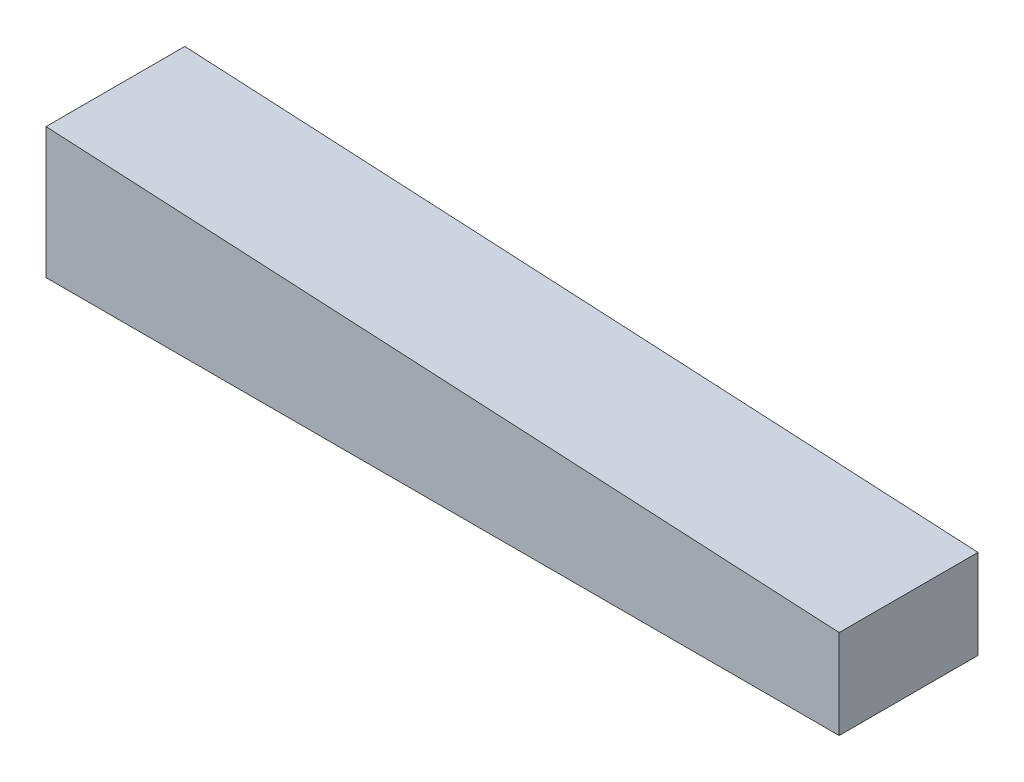
ISO-10303-21;
HEADER;
FILE_DESCRIPTION(('STEP AP214'),'2;1');
FILE_NAME('part.step','',(''),(''),'','','');
FILE_SCHEMA(('AUTOMOTIVE_DESIGN { 1 0 10303 214 1 1 1 1 }'));
ENDSEC;
DATA;
#1=APPLICATION_CONTEXT('core data for automotive mechanical design processes');
#2=APPLICATION_PROTOCOL_DEFINITION('international standard','automotive_design',2000,#1);
#3=PRODUCT_CONTEXT('',#1,'mechanical');
#4=PRODUCT('Part','Part','',(#3));
#5=PRODUCT_RELATED_PRODUCT_CATEGORY('part','',(#4));
#6=PRODUCT_DEFINITION_FORMATION('','',#4);
#7=PRODUCT_DEFINITION_CONTEXT('part definition',#1,'design');
#8=PRODUCT_DEFINITION('design','',#6,#7);
#9=PRODUCT_DEFINITION_SHAPE('','',#8);
#10=(LENGTH_UNIT() NAMED_UNIT(*) SI_UNIT(.MILLI.,.METRE.));
#11=(NAMED_UNIT(*) PLANE_ANGLE_UNIT() SI_UNIT($,.RADIAN.));
#12=(NAMED_UNIT(*) SI_UNIT($,.STERADIAN.) SOLID_ANGLE_UNIT());
#13=UNCERTAINTY_MEASURE_WITH_UNIT(LENGTH_MEASURE(1.E-05),#10,'distance_accuracy_value','');
#14=(GEOMETRIC_REPRESENTATION_CONTEXT(3) GLOBAL_UNCERTAINTY_ASSIGNED_CONTEXT((#13)) GLOBAL_UNIT_ASSIGNED_CONTEXT((#10,
#11,#12)) REPRESENTATION_CONTEXT('',''));
#15=CARTESIAN_POINT('',(0.,0.,0.));
#16=DIRECTION('',(0.,0.,1.));
#17=DIRECTION('',(1.,0.,0.));
#18=AXIS2_PLACEMENT_3D('',#15,#16,#17);
#19=CARTESIAN_POINT('',(80.,9.,-14.));
#20=DIRECTION('',(0.0523359562429439,0.998629534754574,0.));
#21=DIRECTION('',(-0.998629534754574,0.052335956242944,0.));
#22=AXIS2_PLACEMENT_3D('',#19,#20,#21);
#23=PLANE('',#22);
#24=DIRECTION('',(-0.998629534754574,0.052335956242944,0.));
#25=VECTOR('',#24,1.);
#26=CARTESIAN_POINT('',(0.689502269973509,13.1564870598634,0.));
#27=LINE('',#26,#25);
#28=CARTESIAN_POINT('',(0.,13.1926223426433,0.));
#29=VERTEX_POINT('',#28);
#30=CARTESIAN_POINT('',(80.,9.,0.));
#31=VERTEX_POINT('',#30);
#32=EDGE_CURVE('E89',#29,#31,#27,.F.);
#33=ORIENTED_EDGE('',*,*,#32,.T.);
#34=DIRECTION('',(0.,0.,1.));
#35=VECTOR('',#34,1.);
#36=CARTESIAN_POINT('',(80.,9.,-14.));
#37=LINE('',#36,#35);
#38=CARTESIAN_POINT('',(80.,9.,-14.));
#39=VERTEX_POINT('',#38);
#40=EDGE_CURVE('E11',#39,#31,#37,.T.);
#41=ORIENTED_EDGE('',*,*,#40,.F.);
#42=DIRECTION('',(-0.998629534754574,0.052335956242944,0.));
#43=VECTOR('',#42,1.);
#44=CARTESIAN_POINT('',(0.689502269973509,13.1564870598634,-14.));
#45=LINE('',#44,#43);
#46=CARTESIAN_POINT('',(0.,13.1926223426433,-14.));
#47=VERTEX_POINT('',#46);
#48=EDGE_CURVE('E40',#47,#39,#45,.F.);
#49=ORIENTED_EDGE('',*,*,#48,.F.);
#50=DIRECTION('',(0.,0.,-1.));
#51=VECTOR('',#50,1.);
#52=CARTESIAN_POINT('',(0.,13.1926223426433,-14.));
#53=LINE('',#52,#51);
#54=EDGE_CURVE('E99',#47,#29,#53,.F.);
#55=ORIENTED_EDGE('',*,*,#54,.T.);
#56=EDGE_LOOP('',(#33,#41,#49,#55));
#57=FACE_BOUND('',#56,.T.);
#58=ADVANCED_FACE('F37',(#57),#23,.T.);
#59=CARTESIAN_POINT('',(80.,0.,-14.));
#60=DIRECTION('',(1.,0.,0.));
#61=DIRECTION('',(0.,0.,-1.));
#62=AXIS2_PLACEMENT_3D('',#59,#60,#61);
#63=PLANE('',#62);
#64=DIRECTION('',(0.,1.,0.));
#65=VECTOR('',#64,1.);
#66=CARTESIAN_POINT('',(80.,0.,0.));
#67=LINE('',#66,#65);
#68=CARTESIAN_POINT('',(80.,0.,0.));
#69=VERTEX_POINT('',#68);
#70=EDGE_CURVE('E100',#69,#31,#67,.T.);
#71=ORIENTED_EDGE('',*,*,#70,.F.);
#72=DIRECTION('',(0.,0.,1.));
#73=VECTOR('',#72,1.);
#74=CARTESIAN_POINT('',(80.,0.,-14.));
#75=LINE('',#74,#73);
#76=CARTESIAN_POINT('',(80.,0.,-14.));
#77=VERTEX_POINT('',#76);
#78=EDGE_CURVE('E45',#77,#69,#75,.T.);
#79=ORIENTED_EDGE('',*,*,#78,.F.);
#80=DIRECTION('',(0.,1.,0.));
#81=VECTOR('',#80,1.);
#82=CARTESIAN_POINT('',(80.,0.,-14.));
#83=LINE('',#82,#81);
#84=EDGE_CURVE('E85',#77,#39,#83,.T.);
#85=ORIENTED_EDGE('',*,*,#84,.T.);
#86=ORIENTED_EDGE('',*,*,#40,.T.);
#87=EDGE_LOOP('',(#71,#79,#85,#86));
#88=FACE_BOUND('',#87,.T.);
#89=ADVANCED_FACE('F93',(#88),#63,.T.);
#90=CARTESIAN_POINT('',(0.,0.,-14.));
#91=DIRECTION('',(0.,-1.,0.));
#92=DIRECTION('',(0.,0.,-1.));
#93=AXIS2_PLACEMENT_3D('',#90,#91,#92);
#94=PLANE('',#93);
#95=DIRECTION('',(1.,0.,0.));
#96=VECTOR('',#95,1.);
#97=CARTESIAN_POINT('',(0.,0.,0.));
#98=LINE('',#97,#96);
#99=CARTESIAN_POINT('',(0.,0.,0.));
#100=VERTEX_POINT('',#99);
#101=EDGE_CURVE('E102',#100,#69,#98,.T.);
#102=ORIENTED_EDGE('',*,*,#101,.F.);
#103=DIRECTION('',(0.,0.,1.));
#104=VECTOR('',#103,1.);
#105=CARTESIAN_POINT('',(0.,0.,-14.));
#106=LINE('',#105,#104);
#107=CARTESIAN_POINT('',(0.,0.,-14.));
#108=VERTEX_POINT('',#107);
#109=EDGE_CURVE('E62',#108,#100,#106,.T.);
#110=ORIENTED_EDGE('',*,*,#109,.F.);
#111=DIRECTION('',(1.,0.,0.));
#112=VECTOR('',#111,1.);
#113=CARTESIAN_POINT('',(0.,0.,-14.));
#114=LINE('',#113,#112);
#115=EDGE_CURVE('E94',#108,#77,#114,.T.);
#116=ORIENTED_EDGE('',*,*,#115,.T.);
#117=ORIENTED_EDGE('',*,*,#78,.T.);
#118=EDGE_LOOP('',(#102,#110,#116,#117));
#119=FACE_BOUND('',#118,.T.);
#120=ADVANCED_FACE('F110',(#119),#94,.T.);
#121=CARTESIAN_POINT('',(0.,0.,-14.));
#122=DIRECTION('',(1.,0.,0.));
#123=DIRECTION('',(0.,0.,-1.));
#124=AXIS2_PLACEMENT_3D('',#121,#122,#123);
#125=PLANE('',#124);
#126=DIRECTION('',(0.,1.,0.));
#127=VECTOR('',#126,1.);
#128=CARTESIAN_POINT('',(0.,0.,0.));
#129=LINE('',#128,#127);
#130=EDGE_CURVE('E78',#100,#29,#129,.T.);
#131=ORIENTED_EDGE('',*,*,#130,.T.);
#132=ORIENTED_EDGE('',*,*,#54,.F.);
#133=DIRECTION('',(0.,1.,0.));
#134=VECTOR('',#133,1.);
#135=CARTESIAN_POINT('',(0.,0.,-14.));
#136=LINE('',#135,#134);
#137=EDGE_CURVE('E53',#108,#47,#136,.T.);
#138=ORIENTED_EDGE('',*,*,#137,.F.);
#139=ORIENTED_EDGE('',*,*,#109,.T.);
#140=EDGE_LOOP('',(#131,#132,#138,#139));
#141=FACE_BOUND('',#140,.T.);
#142=ADVANCED_FACE('F112',(#141),#125,.F.);
#143=CARTESIAN_POINT('',(0.,0.,-14.));
#144=DIRECTION('',(0.,0.,1.));
#145=DIRECTION('',(1.,0.,0.));
#146=AXIS2_PLACEMENT_3D('',#143,#144,#145);
#147=PLANE('',#146);
#148=ORIENTED_EDGE('',*,*,#48,.T.);
#149=ORIENTED_EDGE('',*,*,#84,.F.);
#150=ORIENTED_EDGE('',*,*,#115,.F.);
#151=ORIENTED_EDGE('',*,*,#137,.T.);
#152=EDGE_LOOP('',(#148,#149,#150,#151));
#153=FACE_BOUND('',#152,.T.);
#154=ADVANCED_FACE('F83',(#153),#147,.F.);
#155=CARTESIAN_POINT('',(0.,0.,0.));
#156=DIRECTION('',(0.,0.,1.));
#157=DIRECTION('',(1.,0.,0.));
#158=AXIS2_PLACEMENT_3D('',#155,#156,#157);
#159=PLANE('',#158);
#160=ORIENTED_EDGE('',*,*,#32,.F.);
#161=ORIENTED_EDGE('',*,*,#130,.F.);
#162=ORIENTED_EDGE('',*,*,#101,.T.);
#163=ORIENTED_EDGE('',*,*,#70,.T.);
#164=EDGE_LOOP('',(#160,#161,#162,#163));
#165=FACE_BOUND('',#164,.T.);
#166=ADVANCED_FACE('F109',(#165),#159,.T.);
#167=CLOSED_SHELL('',(#58,#89,#120,#142,#154,#166));
#168=MANIFOLD_SOLID_BREP('B2',#167);
#169=ADVANCED_BREP_SHAPE_REPRESENTATION('',(#18,#168),#14);
#170=SHAPE_DEFINITION_REPRESENTATION(#9,#169);
ENDSEC;
END-ISO-10303-21;
